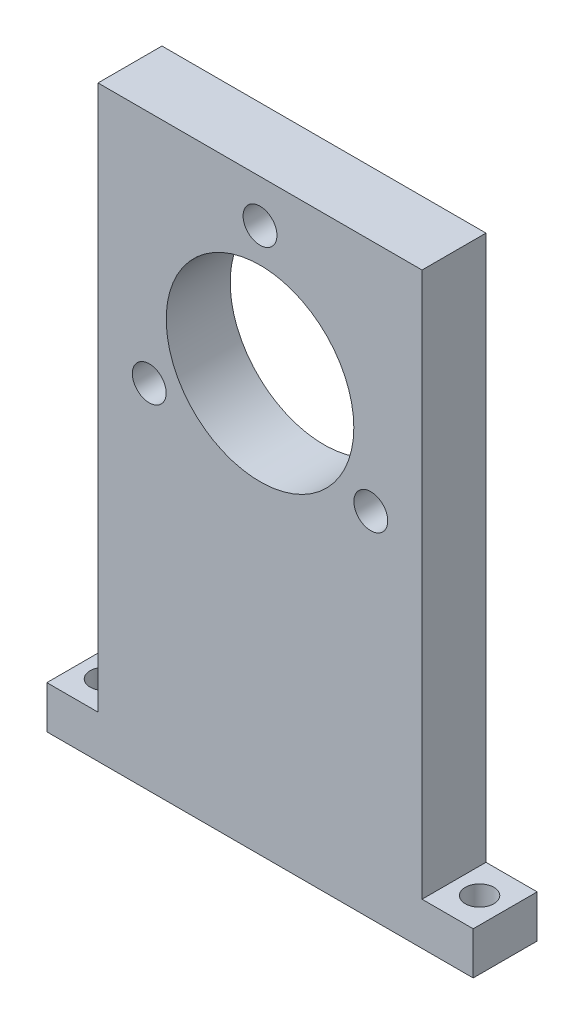
ISO-10303-21;
HEADER;
FILE_DESCRIPTION(('STEP AP214'),'2;1');
FILE_NAME('part.step','',(''),(''),'','','');
FILE_SCHEMA(('AUTOMOTIVE_DESIGN { 1 0 10303 214 1 1 1 1 }'));
ENDSEC;
DATA;
#1=APPLICATION_CONTEXT('core data for automotive mechanical design processes');
#2=APPLICATION_PROTOCOL_DEFINITION('international standard','automotive_design',2000,#1);
#3=PRODUCT_CONTEXT('',#1,'mechanical');
#4=PRODUCT('Part','Part','',(#3));
#5=PRODUCT_RELATED_PRODUCT_CATEGORY('part','',(#4));
#6=PRODUCT_DEFINITION_FORMATION('','',#4);
#7=PRODUCT_DEFINITION_CONTEXT('part definition',#1,'design');
#8=PRODUCT_DEFINITION('design','',#6,#7);
#9=PRODUCT_DEFINITION_SHAPE('','',#8);
#10=(LENGTH_UNIT() NAMED_UNIT(*) SI_UNIT(.MILLI.,.METRE.));
#11=(NAMED_UNIT(*) PLANE_ANGLE_UNIT() SI_UNIT($,.RADIAN.));
#12=(NAMED_UNIT(*) SI_UNIT($,.STERADIAN.) SOLID_ANGLE_UNIT());
#13=UNCERTAINTY_MEASURE_WITH_UNIT(LENGTH_MEASURE(1.E-05),#10,'distance_accuracy_value','');
#14=(GEOMETRIC_REPRESENTATION_CONTEXT(3) GLOBAL_UNCERTAINTY_ASSIGNED_CONTEXT((#13)) GLOBAL_UNIT_ASSIGNED_CONTEXT((#10,
#11,#12)) REPRESENTATION_CONTEXT('',''));
#15=CARTESIAN_POINT('',(0.,0.,0.));
#16=DIRECTION('',(0.,0.,1.));
#17=DIRECTION('',(1.,0.,0.));
#18=AXIS2_PLACEMENT_3D('',#15,#16,#17);
#19=CARTESIAN_POINT('',(18.9999999999998,5.00000000000006,-7.50000000000017));
#20=DIRECTION('',(1.,0.,0.));
#21=DIRECTION('',(0.,1.,0.));
#22=AXIS2_PLACEMENT_3D('',#19,#20,#21);
#23=PLANE('',#22);
#24=DIRECTION('',(0.,1.,0.));
#25=VECTOR('',#24,1.);
#26=CARTESIAN_POINT('',(18.9999999999998,5.0000000000002,0.));
#27=LINE('',#26,#25);
#28=CARTESIAN_POINT('',(18.9999999999998,5.0000000000002,0.));
#29=VERTEX_POINT('',#28);
#30=CARTESIAN_POINT('',(18.9999999999998,68.9056000000001,-1.11022302462516E-13));
#31=VERTEX_POINT('',#30);
#32=EDGE_CURVE('E138',#29,#31,#27,.T.);
#33=ORIENTED_EDGE('',*,*,#32,.F.);
#34=DIRECTION('',(0.,0.,1.));
#35=VECTOR('',#34,1.);
#36=CARTESIAN_POINT('',(18.9999999999998,5.00000000000006,-7.50000000000017));
#37=LINE('',#36,#35);
#38=CARTESIAN_POINT('',(18.9999999999998,5.00000000000006,-7.50000000000017));
#39=VERTEX_POINT('',#38);
#40=EDGE_CURVE('E11',#39,#29,#37,.T.);
#41=ORIENTED_EDGE('',*,*,#40,.F.);
#42=DIRECTION('',(0.,1.,0.));
#43=VECTOR('',#42,1.);
#44=CARTESIAN_POINT('',(18.9999999999998,5.00000000000006,-7.50000000000017));
#45=LINE('',#44,#43);
#46=CARTESIAN_POINT('',(18.9999999999999,68.9056000000001,-7.50000000000017));
#47=VERTEX_POINT('',#46);
#48=EDGE_CURVE('E159',#39,#47,#45,.T.);
#49=ORIENTED_EDGE('',*,*,#48,.T.);
#50=DIRECTION('',(0.,0.,1.));
#51=VECTOR('',#50,1.);
#52=CARTESIAN_POINT('',(18.9999999999999,68.9056000000001,-7.50000000000017));
#53=LINE('',#52,#51);
#54=EDGE_CURVE('E44',#47,#31,#53,.T.);
#55=ORIENTED_EDGE('',*,*,#54,.T.);
#56=EDGE_LOOP('',(#33,#41,#49,#55));
#57=FACE_BOUND('',#56,.T.);
#58=ADVANCED_FACE('F41',(#57),#23,.T.);
#59=CARTESIAN_POINT('',(24.9999999999999,5.00000000000014,-7.50000000000012));
#60=DIRECTION('',(0.,1.,0.));
#61=DIRECTION('',(-1.,0.,0.));
#62=AXIS2_PLACEMENT_3D('',#59,#60,#61);
#63=PLANE('',#62);
#64=CARTESIAN_POINT('',(22.,5.,-3.74999999999998));
#65=DIRECTION('',(0.,1.,0.));
#66=DIRECTION('',(0.,0.,1.));
#67=AXIS2_PLACEMENT_3D('',#64,#65,#66);
#68=CIRCLE('',#67,1.675);
#69=CARTESIAN_POINT('',(22.,5.,-2.07499999999997));
#70=VERTEX_POINT('',#69);
#71=EDGE_CURVE('E240',#70,#70,#68,.T.);
#72=ORIENTED_EDGE('',*,*,#71,.F.);
#73=EDGE_LOOP('',(#72));
#74=FACE_BOUND('',#73,.T.);
#75=DIRECTION('',(-1.,0.,0.));
#76=VECTOR('',#75,1.);
#77=CARTESIAN_POINT('',(24.9999999999996,5.00000000000009,0.));
#78=LINE('',#77,#76);
#79=CARTESIAN_POINT('',(24.9999999999996,5.00000000000009,0.));
#80=VERTEX_POINT('',#79);
#81=EDGE_CURVE('E157',#80,#29,#78,.T.);
#82=ORIENTED_EDGE('',*,*,#81,.F.);
#83=DIRECTION('',(0.,0.,1.));
#84=VECTOR('',#83,1.);
#85=CARTESIAN_POINT('',(24.9999999999999,5.00000000000014,-7.50000000000012));
#86=LINE('',#85,#84);
#87=CARTESIAN_POINT('',(24.9999999999999,5.00000000000014,-7.50000000000012));
#88=VERTEX_POINT('',#87);
#89=EDGE_CURVE('E50',#88,#80,#86,.T.);
#90=ORIENTED_EDGE('',*,*,#89,.F.);
#91=DIRECTION('',(-1.,0.,0.));
#92=VECTOR('',#91,1.);
#93=CARTESIAN_POINT('',(24.9999999999999,5.00000000000014,-7.50000000000012));
#94=LINE('',#93,#92);
#95=EDGE_CURVE('E128',#88,#39,#94,.T.);
#96=ORIENTED_EDGE('',*,*,#95,.T.);
#97=ORIENTED_EDGE('',*,*,#40,.T.);
#98=EDGE_LOOP('',(#82,#90,#96,#97));
#99=FACE_BOUND('',#98,.T.);
#100=ADVANCED_FACE('F171',(#74,#99),#63,.T.);
#101=CARTESIAN_POINT('',(24.9999999999999,1.38777878078145E-13,-7.50000000000006));
#102=DIRECTION('',(1.,0.,0.));
#103=DIRECTION('',(0.,0.,-1.));
#104=AXIS2_PLACEMENT_3D('',#101,#102,#103);
#105=PLANE('',#104);
#106=DIRECTION('',(0.,1.,0.));
#107=VECTOR('',#106,1.);
#108=CARTESIAN_POINT('',(24.9999999999996,0.,-1.66533453693773E-13));
#109=LINE('',#108,#107);
#110=CARTESIAN_POINT('',(24.9999999999996,0.,-1.66533453693773E-13));
#111=VERTEX_POINT('',#110);
#112=EDGE_CURVE('E115',#111,#80,#109,.T.);
#113=ORIENTED_EDGE('',*,*,#112,.F.);
#114=DIRECTION('',(0.,0.,1.));
#115=VECTOR('',#114,1.);
#116=CARTESIAN_POINT('',(24.9999999999999,1.38777878078145E-13,-7.50000000000006));
#117=LINE('',#116,#115);
#118=CARTESIAN_POINT('',(24.9999999999999,1.38777878078145E-13,-7.50000000000006));
#119=VERTEX_POINT('',#118);
#120=EDGE_CURVE('E110',#119,#111,#117,.T.);
#121=ORIENTED_EDGE('',*,*,#120,.F.);
#122=DIRECTION('',(0.,1.,0.));
#123=VECTOR('',#122,1.);
#124=CARTESIAN_POINT('',(24.9999999999999,1.38777878078145E-13,-7.50000000000006));
#125=LINE('',#124,#123);
#126=EDGE_CURVE('E113',#119,#88,#125,.T.);
#127=ORIENTED_EDGE('',*,*,#126,.T.);
#128=ORIENTED_EDGE('',*,*,#89,.T.);
#129=EDGE_LOOP('',(#113,#121,#127,#128));
#130=FACE_BOUND('',#129,.T.);
#131=ADVANCED_FACE('F112',(#130),#105,.T.);
#132=CARTESIAN_POINT('',(-25.0000000000004,0.,-7.50000000000006));
#133=DIRECTION('',(0.,-1.,0.));
#134=DIRECTION('',(0.,0.,-1.));
#135=AXIS2_PLACEMENT_3D('',#132,#133,#134);
#136=PLANE('',#135);
#137=CARTESIAN_POINT('',(21.9999999999998,2.22044604925031E-13,-3.75000000000003));
#138=DIRECTION('',(0.,1.,0.));
#139=DIRECTION('',(0.,0.,1.));
#140=AXIS2_PLACEMENT_3D('',#137,#138,#139);
#141=CIRCLE('',#140,1.675);
#142=CARTESIAN_POINT('',(21.9999999999998,2.22137586103344E-13,-2.07500000000003));
#143=VERTEX_POINT('',#142);
#144=EDGE_CURVE('E238',#143,#143,#141,.T.);
#145=ORIENTED_EDGE('',*,*,#144,.T.);
#146=EDGE_LOOP('',(#145));
#147=FACE_BOUND('',#146,.T.);
#148=CARTESIAN_POINT('',(-22.0000000000002,0.,-3.75000000000009));
#149=DIRECTION('',(0.,1.,0.));
#150=DIRECTION('',(0.,0.,1.));
#151=AXIS2_PLACEMENT_3D('',#148,#149,#150);
#152=CIRCLE('',#151,1.675);
#153=CARTESIAN_POINT('',(-22.0000000000002,0.,-2.07500000000009));
#154=VERTEX_POINT('',#153);
#155=EDGE_CURVE('E246',#154,#154,#152,.T.);
#156=ORIENTED_EDGE('',*,*,#155,.T.);
#157=EDGE_LOOP('',(#156));
#158=FACE_BOUND('',#157,.T.);
#159=DIRECTION('',(1.,0.,0.));
#160=VECTOR('',#159,1.);
#161=CARTESIAN_POINT('',(-25.0000000000004,1.94289029309402E-13,0.));
#162=LINE('',#161,#160);
#163=CARTESIAN_POINT('',(-25.0000000000004,1.94289029309402E-13,0.));
#164=VERTEX_POINT('',#163);
#165=EDGE_CURVE('E154',#164,#111,#162,.T.);
#166=ORIENTED_EDGE('',*,*,#165,.F.);
#167=DIRECTION('',(0.,0.,1.));
#168=VECTOR('',#167,1.);
#169=CARTESIAN_POINT('',(-25.0000000000004,0.,-7.50000000000006));
#170=LINE('',#169,#168);
#171=CARTESIAN_POINT('',(-25.0000000000004,0.,-7.50000000000006));
#172=VERTEX_POINT('',#171);
#173=EDGE_CURVE('E120',#172,#164,#170,.T.);
#174=ORIENTED_EDGE('',*,*,#173,.F.);
#175=DIRECTION('',(1.,0.,0.));
#176=VECTOR('',#175,1.);
#177=CARTESIAN_POINT('',(-25.0000000000004,0.,-7.50000000000006));
#178=LINE('',#177,#176);
#179=EDGE_CURVE('E126',#172,#119,#178,.T.);
#180=ORIENTED_EDGE('',*,*,#179,.T.);
#181=ORIENTED_EDGE('',*,*,#120,.T.);
#182=EDGE_LOOP('',(#166,#174,#180,#181));
#183=FACE_BOUND('',#182,.T.);
#184=ADVANCED_FACE('F130',(#147,#158,#183),#136,.T.);
#185=CARTESIAN_POINT('',(-25.0000000000001,5.00000000000006,-7.50000000000006));
#186=DIRECTION('',(-1.,0.,0.));
#187=DIRECTION('',(0.,0.,1.));
#188=AXIS2_PLACEMENT_3D('',#185,#186,#187);
#189=PLANE('',#188);
#190=DIRECTION('',(0.,-1.,0.));
#191=VECTOR('',#190,1.);
#192=CARTESIAN_POINT('',(-25.0000000000004,5.00000000000003,-1.66533453693773E-13));
#193=LINE('',#192,#191);
#194=CARTESIAN_POINT('',(-25.0000000000004,5.00000000000003,-1.66533453693773E-13));
#195=VERTEX_POINT('',#194);
#196=EDGE_CURVE('E151',#195,#164,#193,.T.);
#197=ORIENTED_EDGE('',*,*,#196,.F.);
#198=DIRECTION('',(0.,0.,1.));
#199=VECTOR('',#198,1.);
#200=CARTESIAN_POINT('',(-25.0000000000001,5.00000000000006,-7.50000000000006));
#201=LINE('',#200,#199);
#202=CARTESIAN_POINT('',(-25.0000000000001,5.00000000000006,-7.50000000000006));
#203=VERTEX_POINT('',#202);
#204=EDGE_CURVE('E163',#203,#195,#201,.T.);
#205=ORIENTED_EDGE('',*,*,#204,.F.);
#206=DIRECTION('',(0.,-1.,0.));
#207=VECTOR('',#206,1.);
#208=CARTESIAN_POINT('',(-25.0000000000001,5.00000000000006,-7.50000000000006));
#209=LINE('',#208,#207);
#210=EDGE_CURVE('E131',#203,#172,#209,.T.);
#211=ORIENTED_EDGE('',*,*,#210,.T.);
#212=ORIENTED_EDGE('',*,*,#173,.T.);
#213=EDGE_LOOP('',(#197,#205,#211,#212));
#214=FACE_BOUND('',#213,.T.);
#215=ADVANCED_FACE('F186',(#214),#189,.T.);
#216=CARTESIAN_POINT('',(-19.0000000000002,5.00000000000006,-7.50000000000012));
#217=DIRECTION('',(0.,1.,0.));
#218=DIRECTION('',(-1.,0.,0.));
#219=AXIS2_PLACEMENT_3D('',#216,#217,#218);
#220=PLANE('',#219);
#221=CARTESIAN_POINT('',(-22.0000000000002,5.00000000000014,-3.75000000000003));
#222=DIRECTION('',(0.,1.,0.));
#223=DIRECTION('',(0.,0.,1.));
#224=AXIS2_PLACEMENT_3D('',#221,#222,#223);
#225=CIRCLE('',#224,1.675);
#226=CARTESIAN_POINT('',(-22.0000000000002,5.00000000000014,-2.07500000000003));
#227=VERTEX_POINT('',#226);
#228=EDGE_CURVE('E241',#227,#227,#225,.T.);
#229=ORIENTED_EDGE('',*,*,#228,.F.);
#230=EDGE_LOOP('',(#229));
#231=FACE_BOUND('',#230,.T.);
#232=DIRECTION('',(-1.,0.,0.));
#233=VECTOR('',#232,1.);
#234=CARTESIAN_POINT('',(-19.0000000000002,5.00000000000017,-1.11022302462516E-13));
#235=LINE('',#234,#233);
#236=CARTESIAN_POINT('',(-19.0000000000002,5.00000000000017,-1.11022302462516E-13));
#237=VERTEX_POINT('',#236);
#238=EDGE_CURVE('E148',#237,#195,#235,.T.);
#239=ORIENTED_EDGE('',*,*,#238,.F.);
#240=DIRECTION('',(0.,0.,1.));
#241=VECTOR('',#240,1.);
#242=CARTESIAN_POINT('',(-19.0000000000002,5.00000000000006,-7.50000000000012));
#243=LINE('',#242,#241);
#244=CARTESIAN_POINT('',(-19.0000000000002,5.00000000000006,-7.50000000000012));
#245=VERTEX_POINT('',#244);
#246=EDGE_CURVE('E165',#245,#237,#243,.T.);
#247=ORIENTED_EDGE('',*,*,#246,.F.);
#248=DIRECTION('',(-1.,0.,0.));
#249=VECTOR('',#248,1.);
#250=CARTESIAN_POINT('',(-19.0000000000002,5.00000000000006,-7.50000000000012));
#251=LINE('',#250,#249);
#252=EDGE_CURVE('E133',#245,#203,#251,.T.);
#253=ORIENTED_EDGE('',*,*,#252,.T.);
#254=ORIENTED_EDGE('',*,*,#204,.T.);
#255=EDGE_LOOP('',(#239,#247,#253,#254));
#256=FACE_BOUND('',#255,.T.);
#257=ADVANCED_FACE('F190',(#231,#256),#220,.T.);
#258=CARTESIAN_POINT('',(-19.0000000000002,68.9056000000001,-7.50000000000006));
#259=DIRECTION('',(-1.,0.,0.));
#260=DIRECTION('',(0.,-1.,0.));
#261=AXIS2_PLACEMENT_3D('',#258,#259,#260);
#262=PLANE('',#261);
#263=DIRECTION('',(0.,-1.,0.));
#264=VECTOR('',#263,1.);
#265=CARTESIAN_POINT('',(-19.0000000000005,68.9056,-1.11022302462516E-13));
#266=LINE('',#265,#264);
#267=CARTESIAN_POINT('',(-19.0000000000005,68.9056,-1.11022302462516E-13));
#268=VERTEX_POINT('',#267);
#269=EDGE_CURVE('E145',#268,#237,#266,.T.);
#270=ORIENTED_EDGE('',*,*,#269,.F.);
#271=DIRECTION('',(0.,0.,1.));
#272=VECTOR('',#271,1.);
#273=CARTESIAN_POINT('',(-19.0000000000002,68.9056000000001,-7.50000000000006));
#274=LINE('',#273,#272);
#275=CARTESIAN_POINT('',(-19.0000000000002,68.9056000000001,-7.50000000000006));
#276=VERTEX_POINT('',#275);
#277=EDGE_CURVE('E166',#276,#268,#274,.T.);
#278=ORIENTED_EDGE('',*,*,#277,.F.);
#279=DIRECTION('',(0.,-1.,0.));
#280=VECTOR('',#279,1.);
#281=CARTESIAN_POINT('',(-19.0000000000002,68.9056000000001,-7.50000000000006));
#282=LINE('',#281,#280);
#283=EDGE_CURVE('E275',#276,#245,#282,.T.);
#284=ORIENTED_EDGE('',*,*,#283,.T.);
#285=ORIENTED_EDGE('',*,*,#246,.T.);
#286=EDGE_LOOP('',(#270,#278,#284,#285));
#287=FACE_BOUND('',#286,.T.);
#288=ADVANCED_FACE('F194',(#287),#262,.T.);
#289=CARTESIAN_POINT('',(18.9999999999999,68.9056000000001,-7.50000000000017));
#290=DIRECTION('',(0.,1.,0.));
#291=DIRECTION('',(0.,0.,1.));
#292=AXIS2_PLACEMENT_3D('',#289,#290,#291);
#293=PLANE('',#292);
#294=DIRECTION('',(-1.,0.,0.));
#295=VECTOR('',#294,1.);
#296=CARTESIAN_POINT('',(18.9999999999998,68.9056000000001,-1.11022302462516E-13));
#297=LINE('',#296,#295);
#298=EDGE_CURVE('E141',#31,#268,#297,.T.);
#299=ORIENTED_EDGE('',*,*,#298,.F.);
#300=ORIENTED_EDGE('',*,*,#54,.F.);
#301=DIRECTION('',(-1.,0.,0.));
#302=VECTOR('',#301,1.);
#303=CARTESIAN_POINT('',(18.9999999999999,68.9056000000001,-7.50000000000017));
#304=LINE('',#303,#302);
#305=EDGE_CURVE('E273',#47,#276,#304,.T.);
#306=ORIENTED_EDGE('',*,*,#305,.T.);
#307=ORIENTED_EDGE('',*,*,#277,.T.);
#308=EDGE_LOOP('',(#299,#300,#306,#307));
#309=FACE_BOUND('',#308,.T.);
#310=ADVANCED_FACE('F168',(#309),#293,.T.);
#311=CARTESIAN_POINT('',(-1.11022302462516E-13,0.,-7.50000000000006));
#312=DIRECTION('',(0.,0.,1.));
#313=DIRECTION('',(1.,0.,0.));
#314=AXIS2_PLACEMENT_3D('',#311,#312,#313);
#315=PLANE('',#314);
#316=CARTESIAN_POINT('',(-12.9903810567668,41.4056000000001,-7.50000000000012));
#317=DIRECTION('',(0.,0.,1.));
#318=DIRECTION('',(-0.500000000000004,0.866025403784436,0.));
#319=AXIS2_PLACEMENT_3D('',#316,#317,#318);
#320=CIRCLE('',#319,1.984375);
#321=CARTESIAN_POINT('',(-13.9825685567668,43.1241191606348,-7.50000000000012));
#322=VERTEX_POINT('',#321);
#323=EDGE_CURVE('E251',#322,#322,#320,.T.);
#324=ORIENTED_EDGE('',*,*,#323,.T.);
#325=EDGE_LOOP('',(#324));
#326=FACE_BOUND('',#325,.T.);
#327=CARTESIAN_POINT('',(12.9903810567665,41.4056000000002,-7.50000000000006));
#328=DIRECTION('',(0.,0.,1.));
#329=DIRECTION('',(-0.499999999999992,-0.866025403784443,0.));
#330=AXIS2_PLACEMENT_3D('',#327,#328,#329);
#331=CIRCLE('',#330,1.984375);
#332=CARTESIAN_POINT('',(11.9981935567665,39.6870808393655,-7.50000000000006));
#333=VERTEX_POINT('',#332);
#334=EDGE_CURVE('E257',#333,#333,#331,.T.);
#335=ORIENTED_EDGE('',*,*,#334,.T.);
#336=EDGE_LOOP('',(#335));
#337=FACE_BOUND('',#336,.T.);
#338=CARTESIAN_POINT('',(0.,63.9056,-7.50000000000001));
#339=DIRECTION('',(0.,0.,1.));
#340=DIRECTION('',(1.,0.,0.));
#341=AXIS2_PLACEMENT_3D('',#338,#339,#340);
#342=CIRCLE('',#341,1.984375);
#343=CARTESIAN_POINT('',(1.984375,63.9056,-7.50000000000001));
#344=VERTEX_POINT('',#343);
#345=EDGE_CURVE('E262',#344,#344,#342,.T.);
#346=ORIENTED_EDGE('',*,*,#345,.T.);
#347=EDGE_LOOP('',(#346));
#348=FACE_BOUND('',#347,.T.);
#349=CARTESIAN_POINT('',(0.,48.9056,-7.49999999999995));
#350=DIRECTION('',(0.,0.,1.));
#351=DIRECTION('',(1.,0.,0.));
#352=AXIS2_PLACEMENT_3D('',#349,#350,#351);
#353=CIRCLE('',#352,11.);
#354=CARTESIAN_POINT('',(11.,48.9056,-7.49999999999995));
#355=VERTEX_POINT('',#354);
#356=EDGE_CURVE('E142',#355,#355,#353,.T.);
#357=ORIENTED_EDGE('',*,*,#356,.T.);
#358=EDGE_LOOP('',(#357));
#359=FACE_BOUND('',#358,.T.);
#360=ORIENTED_EDGE('',*,*,#48,.F.);
#361=ORIENTED_EDGE('',*,*,#95,.F.);
#362=ORIENTED_EDGE('',*,*,#126,.F.);
#363=ORIENTED_EDGE('',*,*,#179,.F.);
#364=ORIENTED_EDGE('',*,*,#210,.F.);
#365=ORIENTED_EDGE('',*,*,#252,.F.);
#366=ORIENTED_EDGE('',*,*,#283,.F.);
#367=ORIENTED_EDGE('',*,*,#305,.F.);
#368=EDGE_LOOP('',(#360,#361,#362,#363,#364,#365,#366,#367));
#369=FACE_BOUND('',#368,.T.);
#370=ADVANCED_FACE('F124',(#326,#337,#348,#359,#369),#315,.F.);
#371=CARTESIAN_POINT('',(0.,0.,0.));
#372=DIRECTION('',(0.,0.,1.));
#373=DIRECTION('',(1.,0.,0.));
#374=AXIS2_PLACEMENT_3D('',#371,#372,#373);
#375=PLANE('',#374);
#376=CARTESIAN_POINT('',(-12.9903810567666,41.4056000000001,-1.11022302462516E-13));
#377=DIRECTION('',(0.,0.,1.));
#378=DIRECTION('',(-0.500000000000004,0.866025403784436,0.));
#379=AXIS2_PLACEMENT_3D('',#376,#377,#378);
#380=CIRCLE('',#379,1.984375);
#381=CARTESIAN_POINT('',(-13.9825685567667,43.1241191606348,-1.11049841197697E-13));
#382=VERTEX_POINT('',#381);
#383=EDGE_CURVE('E254',#382,#382,#380,.T.);
#384=ORIENTED_EDGE('',*,*,#383,.F.);
#385=EDGE_LOOP('',(#384));
#386=FACE_BOUND('',#385,.T.);
#387=CARTESIAN_POINT('',(12.9903810567664,41.4056000000002,-2.22044604925031E-13));
#388=DIRECTION('',(0.,0.,1.));
#389=DIRECTION('',(-0.499999999999992,-0.866025403784443,0.));
#390=AXIS2_PLACEMENT_3D('',#387,#388,#389);
#391=CIRCLE('',#390,1.984375);
#392=CARTESIAN_POINT('',(11.9981935567664,39.6870808393654,-2.21714140102858E-13));
#393=VERTEX_POINT('',#392);
#394=EDGE_CURVE('E243',#393,#393,#391,.T.);
#395=ORIENTED_EDGE('',*,*,#394,.F.);
#396=EDGE_LOOP('',(#395));
#397=FACE_BOUND('',#396,.T.);
#398=CARTESIAN_POINT('',(-1.11022302462516E-13,63.9056000000001,0.));
#399=DIRECTION('',(0.,0.,1.));
#400=DIRECTION('',(1.,0.,0.));
#401=AXIS2_PLACEMENT_3D('',#398,#399,#400);
#402=CIRCLE('',#401,1.984375);
#403=CARTESIAN_POINT('',(1.98437499999989,63.9056000000001,0.));
#404=VERTEX_POINT('',#403);
#405=EDGE_CURVE('E253',#404,#404,#402,.T.);
#406=ORIENTED_EDGE('',*,*,#405,.F.);
#407=EDGE_LOOP('',(#406));
#408=FACE_BOUND('',#407,.T.);
#409=CARTESIAN_POINT('',(0.,48.9056,0.));
#410=DIRECTION('',(0.,0.,1.));
#411=DIRECTION('',(1.,0.,0.));
#412=AXIS2_PLACEMENT_3D('',#409,#410,#411);
#413=CIRCLE('',#412,11.);
#414=CARTESIAN_POINT('',(11.,48.9056,0.));
#415=VERTEX_POINT('',#414);
#416=EDGE_CURVE('E265',#415,#415,#413,.T.);
#417=ORIENTED_EDGE('',*,*,#416,.F.);
#418=EDGE_LOOP('',(#417));
#419=FACE_BOUND('',#418,.T.);
#420=ORIENTED_EDGE('',*,*,#32,.T.);
#421=ORIENTED_EDGE('',*,*,#298,.T.);
#422=ORIENTED_EDGE('',*,*,#269,.T.);
#423=ORIENTED_EDGE('',*,*,#238,.T.);
#424=ORIENTED_EDGE('',*,*,#196,.T.);
#425=ORIENTED_EDGE('',*,*,#165,.T.);
#426=ORIENTED_EDGE('',*,*,#112,.T.);
#427=ORIENTED_EDGE('',*,*,#81,.T.);
#428=EDGE_LOOP('',(#420,#421,#422,#423,#424,#425,#426,#427));
#429=FACE_BOUND('',#428,.T.);
#430=ADVANCED_FACE('F170',(#386,#397,#408,#419,#429),#375,.T.);
#431=CARTESIAN_POINT('',(0.,48.9056,-7.49999999999995));
#432=DIRECTION('',(0.,0.,1.));
#433=DIRECTION('',(1.,0.,0.));
#434=AXIS2_PLACEMENT_3D('',#431,#432,#433);
#435=CYLINDRICAL_SURFACE('',#434,11.);
#436=ORIENTED_EDGE('',*,*,#356,.F.);
#437=EDGE_LOOP('',(#436));
#438=FACE_BOUND('',#437,.T.);
#439=ORIENTED_EDGE('',*,*,#416,.T.);
#440=EDGE_LOOP('',(#439));
#441=FACE_BOUND('',#440,.T.);
#442=ADVANCED_FACE('F206',(#438,#441),#435,.F.);
#443=CARTESIAN_POINT('',(0.,63.9056,-7.50000000000001));
#444=DIRECTION('',(0.,0.,1.));
#445=DIRECTION('',(1.,0.,0.));
#446=AXIS2_PLACEMENT_3D('',#443,#444,#445);
#447=CYLINDRICAL_SURFACE('',#446,1.984375);
#448=ORIENTED_EDGE('',*,*,#345,.F.);
#449=EDGE_LOOP('',(#448));
#450=FACE_BOUND('',#449,.T.);
#451=ORIENTED_EDGE('',*,*,#405,.T.);
#452=EDGE_LOOP('',(#451));
#453=FACE_BOUND('',#452,.T.);
#454=ADVANCED_FACE('F213',(#450,#453),#447,.F.);
#455=CARTESIAN_POINT('',(12.9903810567665,41.4056000000002,-7.50000000000006));
#456=DIRECTION('',(0.,0.,1.));
#457=DIRECTION('',(1.,0.,0.));
#458=AXIS2_PLACEMENT_3D('',#455,#456,#457);
#459=CYLINDRICAL_SURFACE('',#458,1.984375);
#460=ORIENTED_EDGE('',*,*,#334,.F.);
#461=EDGE_LOOP('',(#460));
#462=FACE_BOUND('',#461,.T.);
#463=ORIENTED_EDGE('',*,*,#394,.T.);
#464=EDGE_LOOP('',(#463));
#465=FACE_BOUND('',#464,.T.);
#466=ADVANCED_FACE('F217',(#462,#465),#459,.F.);
#467=CARTESIAN_POINT('',(-12.9903810567668,41.4056000000001,-7.50000000000012));
#468=DIRECTION('',(0.,0.,1.));
#469=DIRECTION('',(1.,0.,0.));
#470=AXIS2_PLACEMENT_3D('',#467,#468,#469);
#471=CYLINDRICAL_SURFACE('',#470,1.984375);
#472=ORIENTED_EDGE('',*,*,#323,.F.);
#473=EDGE_LOOP('',(#472));
#474=FACE_BOUND('',#473,.T.);
#475=ORIENTED_EDGE('',*,*,#383,.T.);
#476=EDGE_LOOP('',(#475));
#477=FACE_BOUND('',#476,.T.);
#478=ADVANCED_FACE('F221',(#474,#477),#471,.F.);
#479=CARTESIAN_POINT('',(-22.0000000000002,0.,-3.75000000000009));
#480=DIRECTION('',(0.,1.,0.));
#481=DIRECTION('',(0.,0.,1.));
#482=AXIS2_PLACEMENT_3D('',#479,#480,#481);
#483=CYLINDRICAL_SURFACE('',#482,1.675);
#484=ORIENTED_EDGE('',*,*,#155,.F.);
#485=EDGE_LOOP('',(#484));
#486=FACE_BOUND('',#485,.T.);
#487=ORIENTED_EDGE('',*,*,#228,.T.);
#488=EDGE_LOOP('',(#487));
#489=FACE_BOUND('',#488,.T.);
#490=ADVANCED_FACE('F225',(#486,#489),#483,.F.);
#491=CARTESIAN_POINT('',(21.9999999999998,2.22044604925031E-13,-3.75000000000003));
#492=DIRECTION('',(0.,1.,0.));
#493=DIRECTION('',(0.,0.,1.));
#494=AXIS2_PLACEMENT_3D('',#491,#492,#493);
#495=CYLINDRICAL_SURFACE('',#494,1.675);
#496=ORIENTED_EDGE('',*,*,#144,.F.);
#497=EDGE_LOOP('',(#496));
#498=FACE_BOUND('',#497,.T.);
#499=ORIENTED_EDGE('',*,*,#71,.T.);
#500=EDGE_LOOP('',(#499));
#501=FACE_BOUND('',#500,.T.);
#502=ADVANCED_FACE('F229',(#498,#501),#495,.F.);
#503=CLOSED_SHELL('',(#58,#100,#131,#184,#215,#257,#288,#310,#370,#430,#442,#454,#466,#478,#490,#502));
#504=MANIFOLD_SOLID_BREP('B2',#503);
#505=ADVANCED_BREP_SHAPE_REPRESENTATION('',(#18,#504),#14);
#506=SHAPE_DEFINITION_REPRESENTATION(#9,#505);
ENDSEC;
END-ISO-10303-21;
